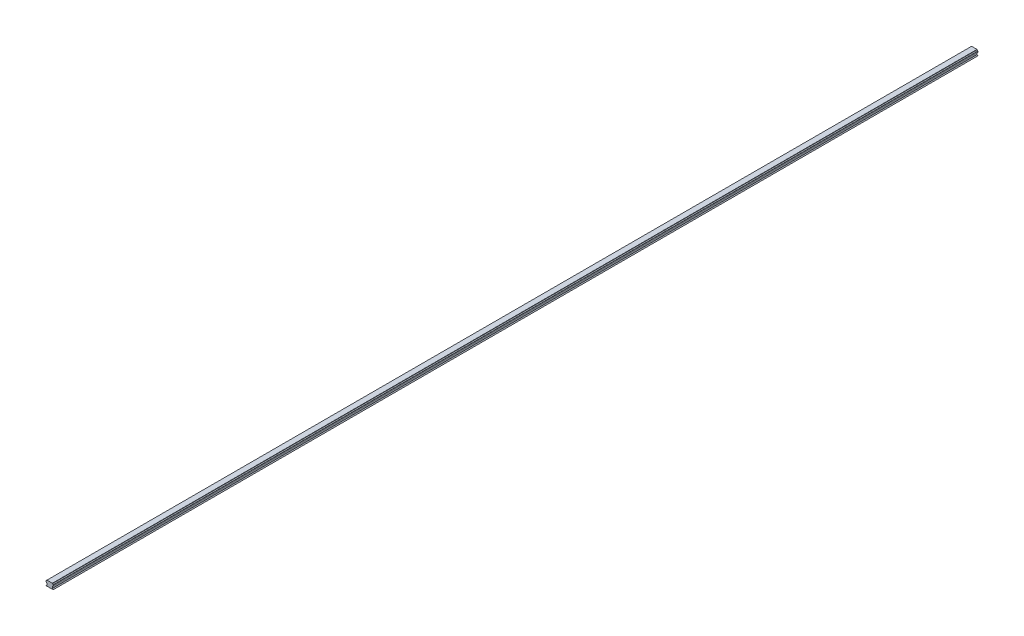
ISO-10303-21;
HEADER;
FILE_DESCRIPTION(('STEP AP214'),'2;1');
FILE_NAME('part.step','',(''),(''),'','','');
FILE_SCHEMA(('AUTOMOTIVE_DESIGN { 1 0 10303 214 1 1 1 1 }'));
ENDSEC;
DATA;
#1=APPLICATION_CONTEXT('core data for automotive mechanical design processes');
#2=APPLICATION_PROTOCOL_DEFINITION('international standard','automotive_design',2000,#1);
#3=PRODUCT_CONTEXT('',#1,'mechanical');
#4=PRODUCT('Part','Part','',(#3));
#5=PRODUCT_RELATED_PRODUCT_CATEGORY('part','',(#4));
#6=PRODUCT_DEFINITION_FORMATION('','',#4);
#7=PRODUCT_DEFINITION_CONTEXT('part definition',#1,'design');
#8=PRODUCT_DEFINITION('design','',#6,#7);
#9=PRODUCT_DEFINITION_SHAPE('','',#8);
#10=(LENGTH_UNIT() NAMED_UNIT(*) SI_UNIT(.MILLI.,.METRE.));
#11=(NAMED_UNIT(*) PLANE_ANGLE_UNIT() SI_UNIT($,.RADIAN.));
#12=(NAMED_UNIT(*) SI_UNIT($,.STERADIAN.) SOLID_ANGLE_UNIT());
#13=UNCERTAINTY_MEASURE_WITH_UNIT(LENGTH_MEASURE(1.E-05),#10,'distance_accuracy_value','');
#14=(GEOMETRIC_REPRESENTATION_CONTEXT(3) GLOBAL_UNCERTAINTY_ASSIGNED_CONTEXT((#13)) GLOBAL_UNIT_ASSIGNED_CONTEXT((#10,
#11,#12)) REPRESENTATION_CONTEXT('',''));
#15=CARTESIAN_POINT('',(0.,0.,0.));
#16=DIRECTION('',(0.,0.,1.));
#17=DIRECTION('',(1.,0.,0.));
#18=AXIS2_PLACEMENT_3D('',#15,#16,#17);
#19=CARTESIAN_POINT('',(12.4987883979856,-8.46322794005069,2900.));
#20=DIRECTION('',(0.,0.,-1.));
#21=DIRECTION('',(-1.,0.,0.));
#22=AXIS2_PLACEMENT_3D('',#19,#20,#21);
#23=CYLINDRICAL_SURFACE('',#22,2.5);
#24=CARTESIAN_POINT('',(12.4987883979856,-8.46322794005069,0.));
#25=DIRECTION('',(0.,0.,1.));
#26=DIRECTION('',(1.,0.,0.));
#27=AXIS2_PLACEMENT_3D('',#24,#25,#26);
#28=CIRCLE('',#27,2.5);
#29=CARTESIAN_POINT('',(12.3041980430387,-5.97081252648865,0.));
#30=VERTEX_POINT('',#29);
#31=CARTESIAN_POINT('',(10.0063729844235,-8.26863758510385,0.));
#32=VERTEX_POINT('',#31);
#33=EDGE_CURVE('E199',#30,#32,#28,.T.);
#34=ORIENTED_EDGE('',*,*,#33,.F.);
#35=DIRECTION('',(0.,0.,-1.));
#36=VECTOR('',#35,1.);
#37=CARTESIAN_POINT('',(12.3041980430387,-5.97081252648865,2900.));
#38=LINE('',#37,#36);
#39=CARTESIAN_POINT('',(12.3041980430387,-5.97081252648865,2900.));
#40=VERTEX_POINT('',#39);
#41=EDGE_CURVE('E11',#40,#30,#38,.T.);
#42=ORIENTED_EDGE('',*,*,#41,.F.);
#43=CARTESIAN_POINT('',(12.4987883979856,-8.46322794005069,2900.));
#44=DIRECTION('',(0.,0.,1.));
#45=DIRECTION('',(1.,0.,0.));
#46=AXIS2_PLACEMENT_3D('',#43,#44,#45);
#47=CIRCLE('',#46,2.5);
#48=CARTESIAN_POINT('',(10.0063729844235,-8.26863758510385,2900.));
#49=VERTEX_POINT('',#48);
#50=EDGE_CURVE('E255',#40,#49,#47,.T.);
#51=ORIENTED_EDGE('',*,*,#50,.T.);
#52=DIRECTION('',(0.,0.,-1.));
#53=VECTOR('',#52,1.);
#54=CARTESIAN_POINT('',(10.0063729844235,-8.26863758510385,2900.));
#55=LINE('',#54,#53);
#56=EDGE_CURVE('E50',#49,#32,#55,.T.);
#57=ORIENTED_EDGE('',*,*,#56,.T.);
#58=EDGE_LOOP('',(#34,#42,#51,#57));
#59=FACE_BOUND('',#58,.T.);
#60=ADVANCED_FACE('F34',(#59),#23,.F.);
#61=CARTESIAN_POINT('',(9.13750528476369,-9.13750528476369,2900.));
#62=DIRECTION('',(0.707106781186548,-0.707106781186548,0.));
#63=DIRECTION('',(0.707106781186548,0.707106781186548,0.));
#64=AXIS2_PLACEMENT_3D('',#61,#62,#63);
#65=PLANE('',#64);
#66=DIRECTION('',(-0.707106781186548,-0.707106781186548,0.));
#67=VECTOR('',#66,1.);
#68=CARTESIAN_POINT('',(9.13750528476369,-9.13750528476369,0.));
#69=LINE('',#68,#67);
#70=CARTESIAN_POINT('',(12.4987883979856,-5.77622217154175,0.));
#71=VERTEX_POINT('',#70);
#72=EDGE_CURVE('E201',#71,#30,#69,.T.);
#73=ORIENTED_EDGE('',*,*,#72,.F.);
#74=DIRECTION('',(0.,0.,-1.));
#75=VECTOR('',#74,1.);
#76=CARTESIAN_POINT('',(12.4987883979856,-5.77622217154175,2900.));
#77=LINE('',#76,#75);
#78=CARTESIAN_POINT('',(12.4987883979856,-5.77622217154175,2900.));
#79=VERTEX_POINT('',#78);
#80=EDGE_CURVE('E42',#79,#71,#77,.T.);
#81=ORIENTED_EDGE('',*,*,#80,.F.);
#82=DIRECTION('',(-0.707106781186548,-0.707106781186548,0.));
#83=VECTOR('',#82,1.);
#84=CARTESIAN_POINT('',(9.13750528476369,-9.13750528476369,2900.));
#85=LINE('',#84,#83);
#86=EDGE_CURVE('E308',#79,#40,#85,.T.);
#87=ORIENTED_EDGE('',*,*,#86,.T.);
#88=ORIENTED_EDGE('',*,*,#41,.T.);
#89=EDGE_LOOP('',(#73,#81,#87,#88));
#90=FACE_BOUND('',#89,.T.);
#91=ADVANCED_FACE('F296',(#90),#65,.T.);
#92=CARTESIAN_POINT('',(12.4987883979856,0.,2900.));
#93=DIRECTION('',(1.,0.,0.));
#94=DIRECTION('',(0.,0.,-1.));
#95=AXIS2_PLACEMENT_3D('',#92,#93,#94);
#96=PLANE('',#95);
#97=DIRECTION('',(0.,-1.,0.));
#98=VECTOR('',#97,1.);
#99=CARTESIAN_POINT('',(12.4987883979856,0.,0.));
#100=LINE('',#99,#98);
#101=CARTESIAN_POINT('',(12.4987883979856,-2.77622217154181,0.));
#102=VERTEX_POINT('',#101);
#103=EDGE_CURVE('E204',#102,#71,#100,.T.);
#104=ORIENTED_EDGE('',*,*,#103,.F.);
#105=DIRECTION('',(0.,0.,-1.));
#106=VECTOR('',#105,1.);
#107=CARTESIAN_POINT('',(12.4987883979856,-2.77622217154181,2900.));
#108=LINE('',#107,#106);
#109=CARTESIAN_POINT('',(12.4987883979856,-2.77622217154181,2900.));
#110=VERTEX_POINT('',#109);
#111=EDGE_CURVE('E285',#110,#102,#108,.T.);
#112=ORIENTED_EDGE('',*,*,#111,.F.);
#113=DIRECTION('',(0.,-1.,0.));
#114=VECTOR('',#113,1.);
#115=CARTESIAN_POINT('',(12.4987883979856,0.,2900.));
#116=LINE('',#115,#114);
#117=EDGE_CURVE('E292',#110,#79,#116,.T.);
#118=ORIENTED_EDGE('',*,*,#117,.T.);
#119=ORIENTED_EDGE('',*,*,#80,.T.);
#120=EDGE_LOOP('',(#104,#112,#118,#119));
#121=FACE_BOUND('',#120,.T.);
#122=ADVANCED_FACE('F290',(#121),#96,.T.);
#123=CARTESIAN_POINT('',(4.86128311322192,4.86128311322192,2900.));
#124=DIRECTION('',(0.707106781186548,0.707106781186548,0.));
#125=DIRECTION('',(-0.707106781186548,0.707106781186548,0.));
#126=AXIS2_PLACEMENT_3D('',#123,#124,#125);
#127=PLANE('',#126);
#128=DIRECTION('',(0.707106781186548,-0.707106781186548,0.));
#129=VECTOR('',#128,1.);
#130=CARTESIAN_POINT('',(4.86128311322192,4.86128311322192,0.));
#131=LINE('',#130,#129);
#132=CARTESIAN_POINT('',(12.3041980430388,-2.58163181659496,0.));
#133=VERTEX_POINT('',#132);
#134=EDGE_CURVE('E207',#133,#102,#131,.T.);
#135=ORIENTED_EDGE('',*,*,#134,.F.);
#136=DIRECTION('',(0.,0.,-1.));
#137=VECTOR('',#136,1.);
#138=CARTESIAN_POINT('',(12.3041980430388,-2.58163181659496,2900.));
#139=LINE('',#138,#137);
#140=CARTESIAN_POINT('',(12.3041980430388,-2.58163181659496,2900.));
#141=VERTEX_POINT('',#140);
#142=EDGE_CURVE('E283',#141,#133,#139,.T.);
#143=ORIENTED_EDGE('',*,*,#142,.F.);
#144=DIRECTION('',(0.707106781186548,-0.707106781186548,0.));
#145=VECTOR('',#144,1.);
#146=CARTESIAN_POINT('',(4.86128311322192,4.86128311322192,2900.));
#147=LINE('',#146,#145);
#148=EDGE_CURVE('E305',#141,#110,#147,.T.);
#149=ORIENTED_EDGE('',*,*,#148,.T.);
#150=ORIENTED_EDGE('',*,*,#111,.T.);
#151=EDGE_LOOP('',(#135,#143,#149,#150));
#152=FACE_BOUND('',#151,.T.);
#153=ADVANCED_FACE('F302',(#152),#127,.T.);
#154=CARTESIAN_POINT('',(12.4987883979856,-0.0892164030329295,2900.));
#155=DIRECTION('',(0.,0.,-1.));
#156=DIRECTION('',(-1.,0.,0.));
#157=AXIS2_PLACEMENT_3D('',#154,#155,#156);
#158=CYLINDRICAL_SURFACE('',#157,2.49999999999998);
#159=CARTESIAN_POINT('',(12.4987883979856,-0.0892164030329295,0.));
#160=DIRECTION('',(0.,0.,1.));
#161=DIRECTION('',(1.,0.,0.));
#162=AXIS2_PLACEMENT_3D('',#159,#160,#161);
#163=CIRCLE('',#162,2.49999999999998);
#164=CARTESIAN_POINT('',(10.0063729844236,-0.283806757979913,0.));
#165=VERTEX_POINT('',#164);
#166=EDGE_CURVE('E210',#165,#133,#163,.T.);
#167=ORIENTED_EDGE('',*,*,#166,.F.);
#168=DIRECTION('',(0.,0.,-1.));
#169=VECTOR('',#168,1.);
#170=CARTESIAN_POINT('',(10.0063729844236,-0.283806757979913,2900.));
#171=LINE('',#170,#169);
#172=CARTESIAN_POINT('',(10.0063729844236,-0.283806757979913,2900.));
#173=VERTEX_POINT('',#172);
#174=EDGE_CURVE('E281',#173,#165,#171,.T.);
#175=ORIENTED_EDGE('',*,*,#174,.F.);
#176=CARTESIAN_POINT('',(12.4987883979856,-0.0892164030329295,2900.));
#177=DIRECTION('',(0.,0.,1.));
#178=DIRECTION('',(1.,0.,0.));
#179=AXIS2_PLACEMENT_3D('',#176,#177,#178);
#180=CIRCLE('',#179,2.49999999999998);
#181=EDGE_CURVE('E310',#173,#141,#180,.T.);
#182=ORIENTED_EDGE('',*,*,#181,.T.);
#183=ORIENTED_EDGE('',*,*,#142,.T.);
#184=EDGE_LOOP('',(#167,#175,#182,#183));
#185=FACE_BOUND('',#184,.T.);
#186=ADVANCED_FACE('F514',(#185),#158,.F.);
#187=CARTESIAN_POINT('',(4.86128311322186,4.86128311322186,2900.));
#188=DIRECTION('',(0.707106781186548,0.707106781186548,0.));
#189=DIRECTION('',(-0.707106781186548,0.707106781186548,0.));
#190=AXIS2_PLACEMENT_3D('',#187,#188,#189);
#191=PLANE('',#190);
#192=DIRECTION('',(0.707106781186548,-0.707106781186548,0.));
#193=VECTOR('',#192,1.);
#194=CARTESIAN_POINT('',(4.86128311322186,4.86128311322186,0.));
#195=LINE('',#194,#193);
#196=CARTESIAN_POINT('',(9.49878839798586,0.223777828457852,0.));
#197=VERTEX_POINT('',#196);
#198=EDGE_CURVE('E213',#197,#165,#195,.T.);
#199=ORIENTED_EDGE('',*,*,#198,.F.);
#200=DIRECTION('',(0.,0.,-1.));
#201=VECTOR('',#200,1.);
#202=CARTESIAN_POINT('',(9.49878839798586,0.223777828457852,2900.));
#203=LINE('',#202,#201);
#204=CARTESIAN_POINT('',(9.49878839798586,0.223777828457852,2900.));
#205=VERTEX_POINT('',#204);
#206=EDGE_CURVE('E279',#205,#197,#203,.T.);
#207=ORIENTED_EDGE('',*,*,#206,.F.);
#208=DIRECTION('',(0.707106781186548,-0.707106781186548,0.));
#209=VECTOR('',#208,1.);
#210=CARTESIAN_POINT('',(4.86128311322186,4.86128311322186,2900.));
#211=LINE('',#210,#209);
#212=EDGE_CURVE('E316',#205,#173,#211,.T.);
#213=ORIENTED_EDGE('',*,*,#212,.T.);
#214=ORIENTED_EDGE('',*,*,#174,.T.);
#215=EDGE_LOOP('',(#199,#207,#213,#214));
#216=FACE_BOUND('',#215,.T.);
#217=ADVANCED_FACE('F504',(#216),#191,.T.);
#218=CARTESIAN_POINT('',(0.,0.223777828457852,2900.));
#219=DIRECTION('',(0.,1.,0.));
#220=DIRECTION('',(0.,0.,1.));
#221=AXIS2_PLACEMENT_3D('',#218,#219,#220);
#222=PLANE('',#221);
#223=DIRECTION('',(1.,0.,0.));
#224=VECTOR('',#223,1.);
#225=CARTESIAN_POINT('',(0.,0.223777828457852,0.));
#226=LINE('',#225,#224);
#227=CARTESIAN_POINT('',(-7.50121160201477,0.223777828457853,0.));
#228=VERTEX_POINT('',#227);
#229=EDGE_CURVE('E216',#228,#197,#226,.T.);
#230=ORIENTED_EDGE('',*,*,#229,.F.);
#231=DIRECTION('',(0.,0.,-1.));
#232=VECTOR('',#231,1.);
#233=CARTESIAN_POINT('',(-7.50121160201477,0.223777828457853,2900.));
#234=LINE('',#233,#232);
#235=CARTESIAN_POINT('',(-7.50121160201477,0.223777828457853,2900.));
#236=VERTEX_POINT('',#235);
#237=EDGE_CURVE('E277',#236,#228,#234,.T.);
#238=ORIENTED_EDGE('',*,*,#237,.F.);
#239=DIRECTION('',(1.,0.,0.));
#240=VECTOR('',#239,1.);
#241=CARTESIAN_POINT('',(0.,0.223777828457852,2900.));
#242=LINE('',#241,#240);
#243=EDGE_CURVE('E319',#236,#205,#242,.T.);
#244=ORIENTED_EDGE('',*,*,#243,.T.);
#245=ORIENTED_EDGE('',*,*,#206,.T.);
#246=EDGE_LOOP('',(#230,#238,#244,#245));
#247=FACE_BOUND('',#246,.T.);
#248=ADVANCED_FACE('F494',(#247),#222,.T.);
#249=CARTESIAN_POINT('',(-3.86249471523632,3.86249471523631,2900.));
#250=DIRECTION('',(-0.707106781186549,0.707106781186546,0.));
#251=DIRECTION('',(-0.707106781186546,-0.707106781186549,0.));
#252=AXIS2_PLACEMENT_3D('',#249,#250,#251);
#253=PLANE('',#252);
#254=DIRECTION('',(0.707106781186546,0.707106781186549,0.));
#255=VECTOR('',#254,1.);
#256=CARTESIAN_POINT('',(-3.86249471523632,3.86249471523631,0.));
#257=LINE('',#256,#255);
#258=CARTESIAN_POINT('',(-8.0087961884529,-0.283806757980286,0.));
#259=VERTEX_POINT('',#258);
#260=EDGE_CURVE('E219',#259,#228,#257,.T.);
#261=ORIENTED_EDGE('',*,*,#260,.F.);
#262=DIRECTION('',(0.,0.,-1.));
#263=VECTOR('',#262,1.);
#264=CARTESIAN_POINT('',(-8.0087961884529,-0.283806757980286,2900.));
#265=LINE('',#264,#263);
#266=CARTESIAN_POINT('',(-8.0087961884529,-0.283806757980286,2900.));
#267=VERTEX_POINT('',#266);
#268=EDGE_CURVE('E275',#267,#259,#265,.T.);
#269=ORIENTED_EDGE('',*,*,#268,.F.);
#270=DIRECTION('',(0.707106781186546,0.707106781186549,0.));
#271=VECTOR('',#270,1.);
#272=CARTESIAN_POINT('',(-3.86249471523632,3.86249471523631,2900.));
#273=LINE('',#272,#271);
#274=EDGE_CURVE('E322',#267,#236,#273,.T.);
#275=ORIENTED_EDGE('',*,*,#274,.T.);
#276=ORIENTED_EDGE('',*,*,#237,.T.);
#277=EDGE_LOOP('',(#261,#269,#275,#276));
#278=FACE_BOUND('',#277,.T.);
#279=ADVANCED_FACE('F484',(#278),#253,.T.);
#280=CARTESIAN_POINT('',(-10.5012116020148,-0.0892164030332557,2900.));
#281=DIRECTION('',(0.,0.,-1.));
#282=DIRECTION('',(-1.,0.,0.));
#283=AXIS2_PLACEMENT_3D('',#280,#281,#282);
#284=CYLINDRICAL_SURFACE('',#283,2.49999999999983);
#285=CARTESIAN_POINT('',(-10.5012116020148,-0.0892164030332557,0.));
#286=DIRECTION('',(0.,0.,1.));
#287=DIRECTION('',(1.,0.,0.));
#288=AXIS2_PLACEMENT_3D('',#285,#286,#287);
#289=CIRCLE('',#288,2.49999999999983);
#290=CARTESIAN_POINT('',(-10.3066212470681,-2.58163181659515,0.));
#291=VERTEX_POINT('',#290);
#292=EDGE_CURVE('E222',#291,#259,#289,.T.);
#293=ORIENTED_EDGE('',*,*,#292,.F.);
#294=DIRECTION('',(0.,0.,-1.));
#295=VECTOR('',#294,1.);
#296=CARTESIAN_POINT('',(-10.3066212470681,-2.58163181659515,2900.));
#297=LINE('',#296,#295);
#298=CARTESIAN_POINT('',(-10.3066212470681,-2.58163181659515,2900.));
#299=VERTEX_POINT('',#298);
#300=EDGE_CURVE('E273',#299,#291,#297,.T.);
#301=ORIENTED_EDGE('',*,*,#300,.F.);
#302=CARTESIAN_POINT('',(-10.5012116020148,-0.0892164030332557,2900.));
#303=DIRECTION('',(0.,0.,1.));
#304=DIRECTION('',(1.,0.,0.));
#305=AXIS2_PLACEMENT_3D('',#302,#303,#304);
#306=CIRCLE('',#305,2.49999999999983);
#307=EDGE_CURVE('E325',#299,#267,#306,.T.);
#308=ORIENTED_EDGE('',*,*,#307,.T.);
#309=ORIENTED_EDGE('',*,*,#268,.T.);
#310=EDGE_LOOP('',(#293,#301,#308,#309));
#311=FACE_BOUND('',#310,.T.);
#312=ADVANCED_FACE('F474',(#311),#284,.F.);
#313=CARTESIAN_POINT('',(-3.86249471523647,3.86249471523647,2900.));
#314=DIRECTION('',(-0.707106781186548,0.707106781186548,0.));
#315=DIRECTION('',(-0.707106781186548,-0.707106781186548,0.));
#316=AXIS2_PLACEMENT_3D('',#313,#314,#315);
#317=PLANE('',#316);
#318=DIRECTION('',(0.707106781186548,0.707106781186548,0.));
#319=VECTOR('',#318,1.);
#320=CARTESIAN_POINT('',(-3.86249471523647,3.86249471523647,0.));
#321=LINE('',#320,#319);
#322=CARTESIAN_POINT('',(-10.5012116020148,-2.77622217154183,0.));
#323=VERTEX_POINT('',#322);
#324=EDGE_CURVE('E225',#323,#291,#321,.T.);
#325=ORIENTED_EDGE('',*,*,#324,.F.);
#326=DIRECTION('',(0.,0.,-1.));
#327=VECTOR('',#326,1.);
#328=CARTESIAN_POINT('',(-10.5012116020148,-2.77622217154183,2900.));
#329=LINE('',#328,#327);
#330=CARTESIAN_POINT('',(-10.5012116020148,-2.77622217154183,2900.));
#331=VERTEX_POINT('',#330);
#332=EDGE_CURVE('E271',#331,#323,#329,.T.);
#333=ORIENTED_EDGE('',*,*,#332,.F.);
#334=DIRECTION('',(0.707106781186548,0.707106781186548,0.));
#335=VECTOR('',#334,1.);
#336=CARTESIAN_POINT('',(-3.86249471523647,3.86249471523647,2900.));
#337=LINE('',#336,#335);
#338=EDGE_CURVE('E328',#331,#299,#337,.T.);
#339=ORIENTED_EDGE('',*,*,#338,.T.);
#340=ORIENTED_EDGE('',*,*,#300,.T.);
#341=EDGE_LOOP('',(#325,#333,#339,#340));
#342=FACE_BOUND('',#341,.T.);
#343=ADVANCED_FACE('F464',(#342),#317,.T.);
#344=CARTESIAN_POINT('',(-10.5012116020148,0.,2900.));
#345=DIRECTION('',(-1.,0.,0.));
#346=DIRECTION('',(0.,0.,1.));
#347=AXIS2_PLACEMENT_3D('',#344,#345,#346);
#348=PLANE('',#347);
#349=DIRECTION('',(0.,1.,0.));
#350=VECTOR('',#349,1.);
#351=CARTESIAN_POINT('',(-10.5012116020148,0.,0.));
#352=LINE('',#351,#350);
#353=CARTESIAN_POINT('',(-10.5012116020148,-5.77622217154183,0.));
#354=VERTEX_POINT('',#353);
#355=EDGE_CURVE('E228',#354,#323,#352,.T.);
#356=ORIENTED_EDGE('',*,*,#355,.F.);
#357=DIRECTION('',(0.,0.,-1.));
#358=VECTOR('',#357,1.);
#359=CARTESIAN_POINT('',(-10.5012116020148,-5.77622217154183,2900.));
#360=LINE('',#359,#358);
#361=CARTESIAN_POINT('',(-10.5012116020148,-5.77622217154183,2900.));
#362=VERTEX_POINT('',#361);
#363=EDGE_CURVE('E269',#362,#354,#360,.T.);
#364=ORIENTED_EDGE('',*,*,#363,.F.);
#365=DIRECTION('',(0.,1.,0.));
#366=VECTOR('',#365,1.);
#367=CARTESIAN_POINT('',(-10.5012116020148,0.,2900.));
#368=LINE('',#367,#366);
#369=EDGE_CURVE('E331',#362,#331,#368,.T.);
#370=ORIENTED_EDGE('',*,*,#369,.T.);
#371=ORIENTED_EDGE('',*,*,#332,.T.);
#372=EDGE_LOOP('',(#356,#364,#370,#371));
#373=FACE_BOUND('',#372,.T.);
#374=ADVANCED_FACE('F454',(#373),#348,.T.);
#375=CARTESIAN_POINT('',(-8.1387168867783,-8.1387168867783,2900.));
#376=DIRECTION('',(-0.707106781186548,-0.707106781186548,0.));
#377=DIRECTION('',(0.707106781186548,-0.707106781186548,0.));
#378=AXIS2_PLACEMENT_3D('',#375,#376,#377);
#379=PLANE('',#378);
#380=DIRECTION('',(-0.707106781186548,0.707106781186548,0.));
#381=VECTOR('',#380,1.);
#382=CARTESIAN_POINT('',(-8.1387168867783,-8.1387168867783,0.));
#383=LINE('',#382,#381);
#384=CARTESIAN_POINT('',(-10.3066212470679,-5.97081252648868,0.));
#385=VERTEX_POINT('',#384);
#386=EDGE_CURVE('E231',#385,#354,#383,.T.);
#387=ORIENTED_EDGE('',*,*,#386,.F.);
#388=DIRECTION('',(0.,0.,-1.));
#389=VECTOR('',#388,1.);
#390=CARTESIAN_POINT('',(-10.3066212470679,-5.97081252648868,2900.));
#391=LINE('',#390,#389);
#392=CARTESIAN_POINT('',(-10.3066212470679,-5.97081252648868,2900.));
#393=VERTEX_POINT('',#392);
#394=EDGE_CURVE('E267',#393,#385,#391,.T.);
#395=ORIENTED_EDGE('',*,*,#394,.F.);
#396=DIRECTION('',(-0.707106781186548,0.707106781186548,0.));
#397=VECTOR('',#396,1.);
#398=CARTESIAN_POINT('',(-8.1387168867783,-8.1387168867783,2900.));
#399=LINE('',#398,#397);
#400=EDGE_CURVE('E334',#393,#362,#399,.T.);
#401=ORIENTED_EDGE('',*,*,#400,.T.);
#402=ORIENTED_EDGE('',*,*,#363,.T.);
#403=EDGE_LOOP('',(#387,#395,#401,#402));
#404=FACE_BOUND('',#403,.T.);
#405=ADVANCED_FACE('F444',(#404),#379,.T.);
#406=CARTESIAN_POINT('',(-10.5012116020148,-8.46322794005072,2900.));
#407=DIRECTION('',(0.,0.,-1.));
#408=DIRECTION('',(-1.,0.,0.));
#409=AXIS2_PLACEMENT_3D('',#406,#407,#408);
#410=CYLINDRICAL_SURFACE('',#409,2.5);
#411=CARTESIAN_POINT('',(-10.5012116020148,-8.46322794005072,0.));
#412=DIRECTION('',(0.,0.,1.));
#413=DIRECTION('',(1.,0.,0.));
#414=AXIS2_PLACEMENT_3D('',#411,#412,#413);
#415=CIRCLE('',#414,2.5);
#416=CARTESIAN_POINT('',(-8.00879618845272,-8.26863758510388,0.));
#417=VERTEX_POINT('',#416);
#418=EDGE_CURVE('E234',#417,#385,#415,.T.);
#419=ORIENTED_EDGE('',*,*,#418,.F.);
#420=DIRECTION('',(0.,0.,-1.));
#421=VECTOR('',#420,1.);
#422=CARTESIAN_POINT('',(-8.00879618845272,-8.26863758510388,2900.));
#423=LINE('',#422,#421);
#424=CARTESIAN_POINT('',(-8.00879618845272,-8.26863758510388,2900.));
#425=VERTEX_POINT('',#424);
#426=EDGE_CURVE('E265',#425,#417,#423,.T.);
#427=ORIENTED_EDGE('',*,*,#426,.F.);
#428=CARTESIAN_POINT('',(-10.5012116020148,-8.46322794005072,2900.));
#429=DIRECTION('',(0.,0.,1.));
#430=DIRECTION('',(1.,0.,0.));
#431=AXIS2_PLACEMENT_3D('',#428,#429,#430);
#432=CIRCLE('',#431,2.5);
#433=EDGE_CURVE('E337',#425,#393,#432,.T.);
#434=ORIENTED_EDGE('',*,*,#433,.T.);
#435=ORIENTED_EDGE('',*,*,#394,.T.);
#436=EDGE_LOOP('',(#419,#427,#434,#435));
#437=FACE_BOUND('',#436,.T.);
#438=ADVANCED_FACE('F434',(#437),#410,.F.);
#439=CARTESIAN_POINT('',(-8.1387168867783,-8.1387168867783,2900.));
#440=DIRECTION('',(-0.707106781186548,-0.707106781186548,0.));
#441=DIRECTION('',(0.707106781186548,-0.707106781186548,0.));
#442=AXIS2_PLACEMENT_3D('',#439,#440,#441);
#443=PLANE('',#442);
#444=DIRECTION('',(-0.707106781186548,0.707106781186548,0.));
#445=VECTOR('',#444,1.);
#446=CARTESIAN_POINT('',(-8.1387168867783,-8.1387168867783,0.));
#447=LINE('',#446,#445);
#448=CARTESIAN_POINT('',(-7.50121160201465,-8.77622217154195,0.));
#449=VERTEX_POINT('',#448);
#450=EDGE_CURVE('E237',#449,#417,#447,.T.);
#451=ORIENTED_EDGE('',*,*,#450,.F.);
#452=DIRECTION('',(0.,0.,-1.));
#453=VECTOR('',#452,1.);
#454=CARTESIAN_POINT('',(-7.50121160201465,-8.77622217154195,2900.));
#455=LINE('',#454,#453);
#456=CARTESIAN_POINT('',(-7.50121160201465,-8.77622217154195,2900.));
#457=VERTEX_POINT('',#456);
#458=EDGE_CURVE('E263',#457,#449,#455,.T.);
#459=ORIENTED_EDGE('',*,*,#458,.F.);
#460=DIRECTION('',(-0.707106781186548,0.707106781186548,0.));
#461=VECTOR('',#460,1.);
#462=CARTESIAN_POINT('',(-8.1387168867783,-8.1387168867783,2900.));
#463=LINE('',#462,#461);
#464=EDGE_CURVE('E340',#457,#425,#463,.T.);
#465=ORIENTED_EDGE('',*,*,#464,.T.);
#466=ORIENTED_EDGE('',*,*,#426,.T.);
#467=EDGE_LOOP('',(#451,#459,#465,#466));
#468=FACE_BOUND('',#467,.T.);
#469=ADVANCED_FACE('F425',(#468),#443,.T.);
#470=CARTESIAN_POINT('',(-7.50121160201465,0.,2900.));
#471=DIRECTION('',(-1.,0.,0.));
#472=DIRECTION('',(0.,0.,1.));
#473=AXIS2_PLACEMENT_3D('',#470,#471,#472);
#474=PLANE('',#473);
#475=DIRECTION('',(0.,1.,0.));
#476=VECTOR('',#475,1.);
#477=CARTESIAN_POINT('',(-7.50121160201465,0.,0.));
#478=LINE('',#477,#476);
#479=CARTESIAN_POINT('',(-7.50121160201465,-13.7762221715419,0.));
#480=VERTEX_POINT('',#479);
#481=EDGE_CURVE('E240',#480,#449,#478,.T.);
#482=ORIENTED_EDGE('',*,*,#481,.F.);
#483=DIRECTION('',(0.,0.,-1.));
#484=VECTOR('',#483,1.);
#485=CARTESIAN_POINT('',(-7.50121160201465,-13.7762221715419,2900.));
#486=LINE('',#485,#484);
#487=CARTESIAN_POINT('',(-7.50121160201465,-13.7762221715419,2900.));
#488=VERTEX_POINT('',#487);
#489=EDGE_CURVE('E261',#488,#480,#486,.T.);
#490=ORIENTED_EDGE('',*,*,#489,.F.);
#491=DIRECTION('',(0.,1.,0.));
#492=VECTOR('',#491,1.);
#493=CARTESIAN_POINT('',(-7.50121160201465,0.,2900.));
#494=LINE('',#493,#492);
#495=EDGE_CURVE('E343',#488,#457,#494,.T.);
#496=ORIENTED_EDGE('',*,*,#495,.T.);
#497=ORIENTED_EDGE('',*,*,#458,.T.);
#498=EDGE_LOOP('',(#482,#490,#496,#497));
#499=FACE_BOUND('',#498,.T.);
#500=ADVANCED_FACE('F356',(#499),#474,.T.);
#501=CARTESIAN_POINT('',(3.13750528476362,-3.13750528476363,2900.));
#502=DIRECTION('',(-0.707106781186547,0.707106781186548,0.));
#503=DIRECTION('',(-0.707106781186548,-0.707106781186547,0.));
#504=AXIS2_PLACEMENT_3D('',#501,#502,#503);
#505=PLANE('',#504);
#506=DIRECTION('',(0.707106781186548,0.707106781186547,0.));
#507=VECTOR('',#506,1.);
#508=CARTESIAN_POINT('',(3.13750528476362,-3.13750528476363,0.));
#509=LINE('',#508,#507);
#510=CARTESIAN_POINT('',(-10.0012116020146,-16.2762221715419,0.));
#511=VERTEX_POINT('',#510);
#512=EDGE_CURVE('E243',#511,#480,#509,.T.);
#513=ORIENTED_EDGE('',*,*,#512,.F.);
#514=DIRECTION('',(0.,0.,-1.));
#515=VECTOR('',#514,1.);
#516=CARTESIAN_POINT('',(-10.0012116020146,-16.2762221715419,2900.));
#517=LINE('',#516,#515);
#518=CARTESIAN_POINT('',(-10.0012116020146,-16.2762221715419,2900.));
#519=VERTEX_POINT('',#518);
#520=EDGE_CURVE('E259',#519,#511,#517,.T.);
#521=ORIENTED_EDGE('',*,*,#520,.F.);
#522=DIRECTION('',(0.707106781186548,0.707106781186547,0.));
#523=VECTOR('',#522,1.);
#524=CARTESIAN_POINT('',(3.13750528476362,-3.13750528476363,2900.));
#525=LINE('',#524,#523);
#526=EDGE_CURVE('E346',#519,#488,#525,.T.);
#527=ORIENTED_EDGE('',*,*,#526,.T.);
#528=ORIENTED_EDGE('',*,*,#489,.T.);
#529=EDGE_LOOP('',(#513,#521,#527,#528));
#530=FACE_BOUND('',#529,.T.);
#531=ADVANCED_FACE('F350',(#530),#505,.T.);
#532=CARTESIAN_POINT('',(0.,-16.2762221715418,2900.));
#533=DIRECTION('',(0.,1.,0.));
#534=DIRECTION('',(-1.,0.,0.));
#535=AXIS2_PLACEMENT_3D('',#532,#533,#534);
#536=PLANE('',#535);
#537=DIRECTION('',(1.,0.,0.));
#538=VECTOR('',#537,1.);
#539=CARTESIAN_POINT('',(0.,-16.2762221715418,0.));
#540=LINE('',#539,#538);
#541=CARTESIAN_POINT('',(11.9987883979856,-16.2762221715418,0.));
#542=VERTEX_POINT('',#541);
#543=EDGE_CURVE('E246',#511,#542,#540,.T.);
#544=ORIENTED_EDGE('',*,*,#543,.T.);
#545=DIRECTION('',(0.,0.,-1.));
#546=VECTOR('',#545,1.);
#547=CARTESIAN_POINT('',(11.9987883979856,-16.2762221715418,2900.));
#548=LINE('',#547,#546);
#549=CARTESIAN_POINT('',(11.9987883979856,-16.2762221715418,2900.));
#550=VERTEX_POINT('',#549);
#551=EDGE_CURVE('E181',#550,#542,#548,.T.);
#552=ORIENTED_EDGE('',*,*,#551,.F.);
#553=DIRECTION('',(1.,0.,0.));
#554=VECTOR('',#553,1.);
#555=CARTESIAN_POINT('',(0.,-16.2762221715418,2900.));
#556=LINE('',#555,#554);
#557=EDGE_CURVE('E190',#519,#550,#556,.T.);
#558=ORIENTED_EDGE('',*,*,#557,.F.);
#559=ORIENTED_EDGE('',*,*,#520,.T.);
#560=EDGE_LOOP('',(#544,#552,#558,#559));
#561=FACE_BOUND('',#560,.T.);
#562=ADVANCED_FACE('F360',(#561),#536,.F.);
#563=CARTESIAN_POINT('',(-2.13871688677806,-2.13871688677806,2900.));
#564=DIRECTION('',(0.707106781186548,0.707106781186548,0.));
#565=DIRECTION('',(-0.707106781186548,0.707106781186548,0.));
#566=AXIS2_PLACEMENT_3D('',#563,#564,#565);
#567=PLANE('',#566);
#568=DIRECTION('',(0.707106781186548,-0.707106781186548,0.));
#569=VECTOR('',#568,1.);
#570=CARTESIAN_POINT('',(-2.13871688677806,-2.13871688677806,0.));
#571=LINE('',#570,#569);
#572=CARTESIAN_POINT('',(9.49878839798558,-13.7762221715417,0.));
#573=VERTEX_POINT('',#572);
#574=EDGE_CURVE('E177',#573,#542,#571,.T.);
#575=ORIENTED_EDGE('',*,*,#574,.F.);
#576=DIRECTION('',(0.,0.,-1.));
#577=VECTOR('',#576,1.);
#578=CARTESIAN_POINT('',(9.49878839798558,-13.7762221715417,2900.));
#579=LINE('',#578,#577);
#580=CARTESIAN_POINT('',(9.49878839798558,-13.7762221715417,2900.));
#581=VERTEX_POINT('',#580);
#582=EDGE_CURVE('E172',#581,#573,#579,.T.);
#583=ORIENTED_EDGE('',*,*,#582,.F.);
#584=DIRECTION('',(0.707106781186548,-0.707106781186548,0.));
#585=VECTOR('',#584,1.);
#586=CARTESIAN_POINT('',(-2.13871688677806,-2.13871688677806,2900.));
#587=LINE('',#586,#585);
#588=EDGE_CURVE('E175',#581,#550,#587,.T.);
#589=ORIENTED_EDGE('',*,*,#588,.T.);
#590=ORIENTED_EDGE('',*,*,#551,.T.);
#591=EDGE_LOOP('',(#575,#583,#589,#590));
#592=FACE_BOUND('',#591,.T.);
#593=ADVANCED_FACE('F174',(#592),#567,.T.);
#594=CARTESIAN_POINT('',(9.49878839798558,0.,2900.));
#595=DIRECTION('',(1.,0.,0.));
#596=DIRECTION('',(0.,0.,-1.));
#597=AXIS2_PLACEMENT_3D('',#594,#595,#596);
#598=PLANE('',#597);
#599=DIRECTION('',(0.,-1.,0.));
#600=VECTOR('',#599,1.);
#601=CARTESIAN_POINT('',(9.49878839798558,0.,0.));
#602=LINE('',#601,#600);
#603=CARTESIAN_POINT('',(9.49878839798558,-8.77622217154181,0.));
#604=VERTEX_POINT('',#603);
#605=EDGE_CURVE('E250',#604,#573,#602,.T.);
#606=ORIENTED_EDGE('',*,*,#605,.F.);
#607=DIRECTION('',(0.,0.,-1.));
#608=VECTOR('',#607,1.);
#609=CARTESIAN_POINT('',(9.49878839798558,-8.77622217154181,2900.));
#610=LINE('',#609,#608);
#611=CARTESIAN_POINT('',(9.49878839798558,-8.77622217154181,2900.));
#612=VERTEX_POINT('',#611);
#613=EDGE_CURVE('E111',#612,#604,#610,.T.);
#614=ORIENTED_EDGE('',*,*,#613,.F.);
#615=DIRECTION('',(0.,-1.,0.));
#616=VECTOR('',#615,1.);
#617=CARTESIAN_POINT('',(9.49878839798558,0.,2900.));
#618=LINE('',#617,#616);
#619=EDGE_CURVE('E187',#612,#581,#618,.T.);
#620=ORIENTED_EDGE('',*,*,#619,.T.);
#621=ORIENTED_EDGE('',*,*,#582,.T.);
#622=EDGE_LOOP('',(#606,#614,#620,#621));
#623=FACE_BOUND('',#622,.T.);
#624=ADVANCED_FACE('F193',(#623),#598,.T.);
#625=CARTESIAN_POINT('',(9.13750528476369,-9.13750528476369,2900.));
#626=DIRECTION('',(0.707106781186548,-0.707106781186548,0.));
#627=DIRECTION('',(0.707106781186548,0.707106781186548,0.));
#628=AXIS2_PLACEMENT_3D('',#625,#626,#627);
#629=PLANE('',#628);
#630=DIRECTION('',(-0.707106781186548,-0.707106781186548,0.));
#631=VECTOR('',#630,1.);
#632=CARTESIAN_POINT('',(9.13750528476369,-9.13750528476369,0.));
#633=LINE('',#632,#631);
#634=EDGE_CURVE('E252',#32,#604,#633,.T.);
#635=ORIENTED_EDGE('',*,*,#634,.F.);
#636=ORIENTED_EDGE('',*,*,#56,.F.);
#637=DIRECTION('',(-0.707106781186548,-0.707106781186548,0.));
#638=VECTOR('',#637,1.);
#639=CARTESIAN_POINT('',(9.13750528476369,-9.13750528476369,2900.));
#640=LINE('',#639,#638);
#641=EDGE_CURVE('E194',#49,#612,#640,.T.);
#642=ORIENTED_EDGE('',*,*,#641,.T.);
#643=ORIENTED_EDGE('',*,*,#613,.T.);
#644=EDGE_LOOP('',(#635,#636,#642,#643));
#645=FACE_BOUND('',#644,.T.);
#646=ADVANCED_FACE('F373',(#645),#629,.T.);
#647=CARTESIAN_POINT('',(0.,0.,2900.));
#648=DIRECTION('',(0.,0.,1.));
#649=DIRECTION('',(1.,0.,0.));
#650=AXIS2_PLACEMENT_3D('',#647,#648,#649);
#651=PLANE('',#650);
#652=ORIENTED_EDGE('',*,*,#50,.F.);
#653=ORIENTED_EDGE('',*,*,#86,.F.);
#654=ORIENTED_EDGE('',*,*,#117,.F.);
#655=ORIENTED_EDGE('',*,*,#148,.F.);
#656=ORIENTED_EDGE('',*,*,#181,.F.);
#657=ORIENTED_EDGE('',*,*,#212,.F.);
#658=ORIENTED_EDGE('',*,*,#243,.F.);
#659=ORIENTED_EDGE('',*,*,#274,.F.);
#660=ORIENTED_EDGE('',*,*,#307,.F.);
#661=ORIENTED_EDGE('',*,*,#338,.F.);
#662=ORIENTED_EDGE('',*,*,#369,.F.);
#663=ORIENTED_EDGE('',*,*,#400,.F.);
#664=ORIENTED_EDGE('',*,*,#433,.F.);
#665=ORIENTED_EDGE('',*,*,#464,.F.);
#666=ORIENTED_EDGE('',*,*,#495,.F.);
#667=ORIENTED_EDGE('',*,*,#526,.F.);
#668=ORIENTED_EDGE('',*,*,#557,.T.);
#669=ORIENTED_EDGE('',*,*,#588,.F.);
#670=ORIENTED_EDGE('',*,*,#619,.F.);
#671=ORIENTED_EDGE('',*,*,#641,.F.);
#672=EDGE_LOOP('',(#652,#653,#654,#655,#656,#657,#658,#659,#660,#661,#662,#663,#664,#665,#666,
#667,#668,#669,#670,#671));
#673=FACE_BOUND('',#672,.T.);
#674=ADVANCED_FACE('F185',(#673),#651,.T.);
#675=CARTESIAN_POINT('',(0.,0.,0.));
#676=DIRECTION('',(0.,0.,1.));
#677=DIRECTION('',(1.,0.,0.));
#678=AXIS2_PLACEMENT_3D('',#675,#676,#677);
#679=PLANE('',#678);
#680=ORIENTED_EDGE('',*,*,#33,.T.);
#681=ORIENTED_EDGE('',*,*,#634,.T.);
#682=ORIENTED_EDGE('',*,*,#605,.T.);
#683=ORIENTED_EDGE('',*,*,#574,.T.);
#684=ORIENTED_EDGE('',*,*,#543,.F.);
#685=ORIENTED_EDGE('',*,*,#512,.T.);
#686=ORIENTED_EDGE('',*,*,#481,.T.);
#687=ORIENTED_EDGE('',*,*,#450,.T.);
#688=ORIENTED_EDGE('',*,*,#418,.T.);
#689=ORIENTED_EDGE('',*,*,#386,.T.);
#690=ORIENTED_EDGE('',*,*,#355,.T.);
#691=ORIENTED_EDGE('',*,*,#324,.T.);
#692=ORIENTED_EDGE('',*,*,#292,.T.);
#693=ORIENTED_EDGE('',*,*,#260,.T.);
#694=ORIENTED_EDGE('',*,*,#229,.T.);
#695=ORIENTED_EDGE('',*,*,#198,.T.);
#696=ORIENTED_EDGE('',*,*,#166,.T.);
#697=ORIENTED_EDGE('',*,*,#134,.T.);
#698=ORIENTED_EDGE('',*,*,#103,.T.);
#699=ORIENTED_EDGE('',*,*,#72,.T.);
#700=EDGE_LOOP('',(#680,#681,#682,#683,#684,#685,#686,#687,#688,#689,#690,#691,#692,#693,#694,
#695,#696,#697,#698,#699));
#701=FACE_BOUND('',#700,.T.);
#702=ADVANCED_FACE('F298',(#701),#679,.F.);
#703=CLOSED_SHELL('',(#60,#91,#122,#153,#186,#217,#248,#279,#312,#343,#374,#405,#438,#469,#500,
#531,#562,#593,#624,#646,#674,#702));
#704=MANIFOLD_SOLID_BREP('B2',#703);
#705=ADVANCED_BREP_SHAPE_REPRESENTATION('',(#18,#704),#14);
#706=SHAPE_DEFINITION_REPRESENTATION(#9,#705);
ENDSEC;
END-ISO-10303-21;
